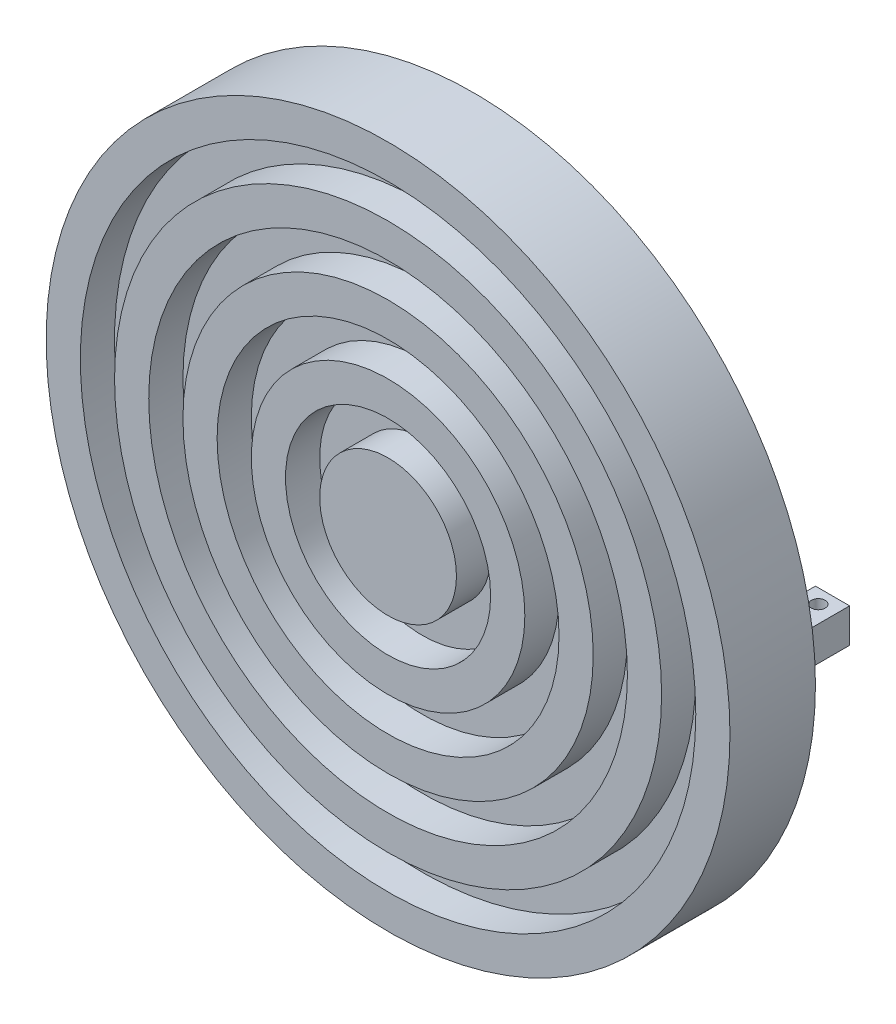
ISO-10303-21;
HEADER;
FILE_DESCRIPTION(('STEP AP214'),'2;1');
FILE_NAME('part.step','',(''),(''),'','','');
FILE_SCHEMA(('AUTOMOTIVE_DESIGN { 1 0 10303 214 1 1 1 1 }'));
ENDSEC;
DATA;
#1=APPLICATION_CONTEXT('core data for automotive mechanical design processes');
#2=APPLICATION_PROTOCOL_DEFINITION('international standard','automotive_design',2000,#1);
#3=PRODUCT_CONTEXT('',#1,'mechanical');
#4=PRODUCT('Part','Part','',(#3));
#5=PRODUCT_RELATED_PRODUCT_CATEGORY('part','',(#4));
#6=PRODUCT_DEFINITION_FORMATION('','',#4);
#7=PRODUCT_DEFINITION_CONTEXT('part definition',#1,'design');
#8=PRODUCT_DEFINITION('design','',#6,#7);
#9=PRODUCT_DEFINITION_SHAPE('','',#8);
#10=(LENGTH_UNIT() NAMED_UNIT(*) SI_UNIT(.MILLI.,.METRE.));
#11=(NAMED_UNIT(*) PLANE_ANGLE_UNIT() SI_UNIT($,.RADIAN.));
#12=(NAMED_UNIT(*) SI_UNIT($,.STERADIAN.) SOLID_ANGLE_UNIT());
#13=UNCERTAINTY_MEASURE_WITH_UNIT(LENGTH_MEASURE(1.E-05),#10,'distance_accuracy_value','');
#14=(GEOMETRIC_REPRESENTATION_CONTEXT(3) GLOBAL_UNCERTAINTY_ASSIGNED_CONTEXT((#13)) GLOBAL_UNIT_ASSIGNED_CONTEXT((#10,
#11,#12)) REPRESENTATION_CONTEXT('',''));
#15=CARTESIAN_POINT('',(0.,0.,0.));
#16=DIRECTION('',(0.,0.,1.));
#17=DIRECTION('',(1.,0.,0.));
#18=AXIS2_PLACEMENT_3D('',#15,#16,#17);
#19=CARTESIAN_POINT('',(0.,0.,0.));
#20=DIRECTION('',(0.,0.,1.));
#21=DIRECTION('',(1.,0.,0.));
#22=AXIS2_PLACEMENT_3D('',#19,#20,#21);
#23=PLANE('',#22);
#24=CARTESIAN_POINT('',(0.,0.,0.));
#25=DIRECTION('',(0.,0.,1.));
#26=DIRECTION('',(1.,0.,0.));
#27=AXIS2_PLACEMENT_3D('',#24,#25,#26);
#28=CIRCLE('',#27,10.);
#29=CARTESIAN_POINT('',(10.,0.,0.));
#30=VERTEX_POINT('',#29);
#31=EDGE_CURVE('E48',#30,#30,#28,.T.);
#32=ORIENTED_EDGE('',*,*,#31,.F.);
#33=EDGE_LOOP('',(#32));
#34=FACE_BOUND('',#33,.T.);
#35=DIRECTION('',(0.,-1.,0.));
#36=VECTOR('',#35,1.);
#37=CARTESIAN_POINT('',(9.,0.5,0.));
#38=LINE('',#37,#36);
#39=CARTESIAN_POINT('',(9.,0.5,0.));
#40=VERTEX_POINT('',#39);
#41=CARTESIAN_POINT('',(9.,-0.5,0.));
#42=VERTEX_POINT('',#41);
#43=EDGE_CURVE('E254',#40,#42,#38,.T.);
#44=ORIENTED_EDGE('',*,*,#43,.F.);
#45=DIRECTION('',(1.,0.,0.));
#46=VECTOR('',#45,1.);
#47=CARTESIAN_POINT('',(8.,0.5,0.));
#48=LINE('',#47,#46);
#49=CARTESIAN_POINT('',(8.,0.5,0.));
#50=VERTEX_POINT('',#49);
#51=EDGE_CURVE('E271',#50,#40,#48,.T.);
#52=ORIENTED_EDGE('',*,*,#51,.F.);
#53=DIRECTION('',(0.,-1.,0.));
#54=VECTOR('',#53,1.);
#55=CARTESIAN_POINT('',(8.,0.5,0.));
#56=LINE('',#55,#54);
#57=CARTESIAN_POINT('',(8.,-0.5,0.));
#58=VERTEX_POINT('',#57);
#59=EDGE_CURVE('E264',#50,#58,#56,.T.);
#60=ORIENTED_EDGE('',*,*,#59,.T.);
#61=DIRECTION('',(1.,0.,0.));
#62=VECTOR('',#61,1.);
#63=CARTESIAN_POINT('',(8.,-0.5,0.));
#64=LINE('',#63,#62);
#65=EDGE_CURVE('E228',#58,#42,#64,.T.);
#66=ORIENTED_EDGE('',*,*,#65,.T.);
#67=EDGE_LOOP('',(#44,#52,#60,#66));
#68=FACE_BOUND('',#67,.T.);
#69=DIRECTION('',(0.,-1.,0.));
#70=VECTOR('',#69,1.);
#71=CARTESIAN_POINT('',(7.,0.5,0.));
#72=LINE('',#71,#70);
#73=CARTESIAN_POINT('',(7.,0.5,0.));
#74=VERTEX_POINT('',#73);
#75=CARTESIAN_POINT('',(7.,-0.5,0.));
#76=VERTEX_POINT('',#75);
#77=EDGE_CURVE('E224',#74,#76,#72,.T.);
#78=ORIENTED_EDGE('',*,*,#77,.F.);
#79=DIRECTION('',(1.,0.,0.));
#80=VECTOR('',#79,1.);
#81=CARTESIAN_POINT('',(6.,0.5,0.));
#82=LINE('',#81,#80);
#83=CARTESIAN_POINT('',(6.,0.5,0.));
#84=VERTEX_POINT('',#83);
#85=EDGE_CURVE('E241',#84,#74,#82,.T.);
#86=ORIENTED_EDGE('',*,*,#85,.F.);
#87=DIRECTION('',(0.,-1.,0.));
#88=VECTOR('',#87,1.);
#89=CARTESIAN_POINT('',(6.,0.5,0.));
#90=LINE('',#89,#88);
#91=CARTESIAN_POINT('',(6.,-0.5,0.));
#92=VERTEX_POINT('',#91);
#93=EDGE_CURVE('E234',#84,#92,#90,.T.);
#94=ORIENTED_EDGE('',*,*,#93,.T.);
#95=DIRECTION('',(1.,0.,0.));
#96=VECTOR('',#95,1.);
#97=CARTESIAN_POINT('',(6.,-0.5,0.));
#98=LINE('',#97,#96);
#99=EDGE_CURVE('E198',#92,#76,#98,.T.);
#100=ORIENTED_EDGE('',*,*,#99,.T.);
#101=EDGE_LOOP('',(#78,#86,#94,#100));
#102=FACE_BOUND('',#101,.T.);
#103=DIRECTION('',(0.,-1.,0.));
#104=VECTOR('',#103,1.);
#105=CARTESIAN_POINT('',(5.,0.5,0.));
#106=LINE('',#105,#104);
#107=CARTESIAN_POINT('',(5.,0.5,0.));
#108=VERTEX_POINT('',#107);
#109=CARTESIAN_POINT('',(5.,-0.5,0.));
#110=VERTEX_POINT('',#109);
#111=EDGE_CURVE('E64',#108,#110,#106,.T.);
#112=ORIENTED_EDGE('',*,*,#111,.F.);
#113=DIRECTION('',(1.,0.,0.));
#114=VECTOR('',#113,1.);
#115=CARTESIAN_POINT('',(4.,0.5,0.));
#116=LINE('',#115,#114);
#117=CARTESIAN_POINT('',(4.,0.5,0.));
#118=VERTEX_POINT('',#117);
#119=EDGE_CURVE('E211',#118,#108,#116,.T.);
#120=ORIENTED_EDGE('',*,*,#119,.F.);
#121=DIRECTION('',(0.,-1.,0.));
#122=VECTOR('',#121,1.);
#123=CARTESIAN_POINT('',(4.,0.5,0.));
#124=LINE('',#123,#122);
#125=CARTESIAN_POINT('',(4.,-0.5,0.));
#126=VERTEX_POINT('',#125);
#127=EDGE_CURVE('E204',#118,#126,#124,.T.);
#128=ORIENTED_EDGE('',*,*,#127,.T.);
#129=DIRECTION('',(1.,0.,0.));
#130=VECTOR('',#129,1.);
#131=CARTESIAN_POINT('',(4.,-0.5,0.));
#132=LINE('',#131,#130);
#133=EDGE_CURVE('E187',#126,#110,#132,.T.);
#134=ORIENTED_EDGE('',*,*,#133,.T.);
#135=EDGE_LOOP('',(#112,#120,#128,#134));
#136=FACE_BOUND('',#135,.T.);
#137=DIRECTION('',(1.,0.,0.));
#138=VECTOR('',#137,1.);
#139=CARTESIAN_POINT('',(2.,0.5,0.));
#140=LINE('',#139,#138);
#141=CARTESIAN_POINT('',(2.,0.5,0.));
#142=VERTEX_POINT('',#141);
#143=CARTESIAN_POINT('',(3.,0.5,0.));
#144=VERTEX_POINT('',#143);
#145=EDGE_CURVE('E157',#142,#144,#140,.T.);
#146=ORIENTED_EDGE('',*,*,#145,.F.);
#147=DIRECTION('',(0.,-1.,0.));
#148=VECTOR('',#147,1.);
#149=CARTESIAN_POINT('',(2.,0.5,0.));
#150=LINE('',#149,#148);
#151=CARTESIAN_POINT('',(2.,-0.5,0.));
#152=VERTEX_POINT('',#151);
#153=EDGE_CURVE('E168',#142,#152,#150,.T.);
#154=ORIENTED_EDGE('',*,*,#153,.T.);
#155=DIRECTION('',(1.,0.,0.));
#156=VECTOR('',#155,1.);
#157=CARTESIAN_POINT('',(2.,-0.5,0.));
#158=LINE('',#157,#156);
#159=CARTESIAN_POINT('',(3.,-0.5,0.));
#160=VERTEX_POINT('',#159);
#161=EDGE_CURVE('E186',#152,#160,#158,.T.);
#162=ORIENTED_EDGE('',*,*,#161,.T.);
#163=DIRECTION('',(0.,-1.,0.));
#164=VECTOR('',#163,1.);
#165=CARTESIAN_POINT('',(3.,0.5,0.));
#166=LINE('',#165,#164);
#167=EDGE_CURVE('E175',#144,#160,#166,.T.);
#168=ORIENTED_EDGE('',*,*,#167,.F.);
#169=EDGE_LOOP('',(#146,#154,#162,#168));
#170=FACE_BOUND('',#169,.T.);
#171=ADVANCED_FACE('F39',(#34,#68,#102,#136,#170),#23,.F.);
#172=CARTESIAN_POINT('',(0.,0.,2.5));
#173=DIRECTION('',(0.,0.,1.));
#174=DIRECTION('',(1.,0.,0.));
#175=AXIS2_PLACEMENT_3D('',#172,#173,#174);
#176=PLANE('',#175);
#177=CARTESIAN_POINT('',(0.,0.,2.49999999999996));
#178=DIRECTION('',(0.,0.,1.));
#179=DIRECTION('',(1.,0.,0.));
#180=AXIS2_PLACEMENT_3D('',#177,#178,#179);
#181=CIRCLE('',#180,9.);
#182=CARTESIAN_POINT('',(9.,0.,2.49999999999996));
#183=VERTEX_POINT('',#182);
#184=EDGE_CURVE('E292',#183,#183,#181,.T.);
#185=ORIENTED_EDGE('',*,*,#184,.F.);
#186=EDGE_LOOP('',(#185));
#187=FACE_BOUND('',#186,.T.);
#188=CARTESIAN_POINT('',(0.,0.,2.5));
#189=DIRECTION('',(0.,0.,1.));
#190=DIRECTION('',(1.,0.,0.));
#191=AXIS2_PLACEMENT_3D('',#188,#189,#190);
#192=CIRCLE('',#191,10.);
#193=CARTESIAN_POINT('',(10.,0.,2.5));
#194=VERTEX_POINT('',#193);
#195=EDGE_CURVE('E11',#194,#194,#192,.T.);
#196=ORIENTED_EDGE('',*,*,#195,.T.);
#197=EDGE_LOOP('',(#196));
#198=FACE_BOUND('',#197,.T.);
#199=ADVANCED_FACE('F372',(#187,#198),#176,.T.);
#200=CARTESIAN_POINT('',(0.,0.,2.5));
#201=DIRECTION('',(0.,0.,-1.));
#202=DIRECTION('',(-1.,0.,0.));
#203=AXIS2_PLACEMENT_3D('',#200,#201,#202);
#204=CYLINDRICAL_SURFACE('',#203,10.);
#205=ORIENTED_EDGE('',*,*,#195,.F.);
#206=EDGE_LOOP('',(#205));
#207=FACE_BOUND('',#206,.T.);
#208=ORIENTED_EDGE('',*,*,#31,.T.);
#209=EDGE_LOOP('',(#208));
#210=FACE_BOUND('',#209,.T.);
#211=ADVANCED_FACE('F41',(#207,#210),#204,.T.);
#212=CARTESIAN_POINT('',(0.,0.,2.5));
#213=DIRECTION('',(0.,0.,1.));
#214=DIRECTION('',(1.,0.,0.));
#215=AXIS2_PLACEMENT_3D('',#212,#213,#214);
#216=CYLINDRICAL_SURFACE('',#215,9.);
#217=CARTESIAN_POINT('',(0.,0.,1.49999999999996));
#218=DIRECTION('',(0.,0.,1.));
#219=DIRECTION('',(1.,0.,0.));
#220=AXIS2_PLACEMENT_3D('',#217,#218,#219);
#221=CIRCLE('',#220,9.);
#222=CARTESIAN_POINT('',(9.,0.,1.49999999999996));
#223=VERTEX_POINT('',#222);
#224=EDGE_CURVE('E289',#223,#223,#221,.T.);
#225=ORIENTED_EDGE('',*,*,#224,.F.);
#226=EDGE_LOOP('',(#225));
#227=FACE_BOUND('',#226,.T.);
#228=ORIENTED_EDGE('',*,*,#184,.T.);
#229=EDGE_LOOP('',(#228));
#230=FACE_BOUND('',#229,.T.);
#231=ADVANCED_FACE('F426',(#227,#230),#216,.F.);
#232=CARTESIAN_POINT('',(8.,0.,1.49999999999996));
#233=DIRECTION('',(0.,0.,-1.));
#234=DIRECTION('',(-1.,0.,0.));
#235=AXIS2_PLACEMENT_3D('',#232,#233,#234);
#236=PLANE('',#235);
#237=CARTESIAN_POINT('',(0.,0.,1.49999999999996));
#238=DIRECTION('',(0.,0.,1.));
#239=DIRECTION('',(1.,0.,0.));
#240=AXIS2_PLACEMENT_3D('',#237,#238,#239);
#241=CIRCLE('',#240,8.);
#242=CARTESIAN_POINT('',(8.,0.,1.49999999999996));
#243=VERTEX_POINT('',#242);
#244=EDGE_CURVE('E286',#243,#243,#241,.T.);
#245=ORIENTED_EDGE('',*,*,#244,.F.);
#246=EDGE_LOOP('',(#245));
#247=FACE_BOUND('',#246,.T.);
#248=ORIENTED_EDGE('',*,*,#224,.T.);
#249=EDGE_LOOP('',(#248));
#250=FACE_BOUND('',#249,.T.);
#251=ADVANCED_FACE('F429',(#247,#250),#236,.F.);
#252=CARTESIAN_POINT('',(0.,0.,2.5));
#253=DIRECTION('',(0.,0.,1.));
#254=DIRECTION('',(1.,0.,0.));
#255=AXIS2_PLACEMENT_3D('',#252,#253,#254);
#256=CYLINDRICAL_SURFACE('',#255,8.);
#257=CARTESIAN_POINT('',(0.,0.,2.49999999999996));
#258=DIRECTION('',(0.,0.,1.));
#259=DIRECTION('',(1.,0.,0.));
#260=AXIS2_PLACEMENT_3D('',#257,#258,#259);
#261=CIRCLE('',#260,8.);
#262=CARTESIAN_POINT('',(8.,0.,2.49999999999996));
#263=VERTEX_POINT('',#262);
#264=EDGE_CURVE('E174',#263,#263,#261,.T.);
#265=ORIENTED_EDGE('',*,*,#264,.F.);
#266=EDGE_LOOP('',(#265));
#267=FACE_BOUND('',#266,.T.);
#268=ORIENTED_EDGE('',*,*,#244,.T.);
#269=EDGE_LOOP('',(#268));
#270=FACE_BOUND('',#269,.T.);
#271=ADVANCED_FACE('F433',(#267,#270),#256,.T.);
#272=CARTESIAN_POINT('',(0.,0.,2.49999999999997));
#273=DIRECTION('',(0.,0.,1.));
#274=DIRECTION('',(1.,0.,0.));
#275=AXIS2_PLACEMENT_3D('',#272,#273,#274);
#276=CIRCLE('',#275,7.);
#277=CARTESIAN_POINT('',(7.,0.,2.49999999999997));
#278=VERTEX_POINT('',#277);
#279=EDGE_CURVE('E304',#278,#278,#276,.T.);
#280=ORIENTED_EDGE('',*,*,#279,.F.);
#281=EDGE_LOOP('',(#280));
#282=FACE_BOUND('',#281,.T.);
#283=ORIENTED_EDGE('',*,*,#264,.T.);
#284=EDGE_LOOP('',(#283));
#285=FACE_BOUND('',#284,.T.);
#286=ADVANCED_FACE('F391',(#282,#285),#176,.T.);
#287=CARTESIAN_POINT('',(0.,0.,2.5));
#288=DIRECTION('',(0.,0.,1.));
#289=DIRECTION('',(1.,0.,0.));
#290=AXIS2_PLACEMENT_3D('',#287,#288,#289);
#291=CYLINDRICAL_SURFACE('',#290,7.);
#292=CARTESIAN_POINT('',(0.,0.,1.49999999999997));
#293=DIRECTION('',(0.,0.,1.));
#294=DIRECTION('',(1.,0.,0.));
#295=AXIS2_PLACEMENT_3D('',#292,#293,#294);
#296=CIRCLE('',#295,7.);
#297=CARTESIAN_POINT('',(7.,0.,1.49999999999997));
#298=VERTEX_POINT('',#297);
#299=EDGE_CURVE('E301',#298,#298,#296,.T.);
#300=ORIENTED_EDGE('',*,*,#299,.F.);
#301=EDGE_LOOP('',(#300));
#302=FACE_BOUND('',#301,.T.);
#303=ORIENTED_EDGE('',*,*,#279,.T.);
#304=EDGE_LOOP('',(#303));
#305=FACE_BOUND('',#304,.T.);
#306=ADVANCED_FACE('F414',(#302,#305),#291,.F.);
#307=CARTESIAN_POINT('',(6.,0.,1.49999999999997));
#308=DIRECTION('',(0.,0.,-1.));
#309=DIRECTION('',(-1.,0.,0.));
#310=AXIS2_PLACEMENT_3D('',#307,#308,#309);
#311=PLANE('',#310);
#312=CARTESIAN_POINT('',(0.,0.,1.49999999999997));
#313=DIRECTION('',(0.,0.,1.));
#314=DIRECTION('',(1.,0.,0.));
#315=AXIS2_PLACEMENT_3D('',#312,#313,#314);
#316=CIRCLE('',#315,6.);
#317=CARTESIAN_POINT('',(6.,0.,1.49999999999997));
#318=VERTEX_POINT('',#317);
#319=EDGE_CURVE('E298',#318,#318,#316,.T.);
#320=ORIENTED_EDGE('',*,*,#319,.F.);
#321=EDGE_LOOP('',(#320));
#322=FACE_BOUND('',#321,.T.);
#323=ORIENTED_EDGE('',*,*,#299,.T.);
#324=EDGE_LOOP('',(#323));
#325=FACE_BOUND('',#324,.T.);
#326=ADVANCED_FACE('F417',(#322,#325),#311,.F.);
#327=CARTESIAN_POINT('',(0.,0.,2.5));
#328=DIRECTION('',(0.,0.,1.));
#329=DIRECTION('',(1.,0.,0.));
#330=AXIS2_PLACEMENT_3D('',#327,#328,#329);
#331=CYLINDRICAL_SURFACE('',#330,6.);
#332=CARTESIAN_POINT('',(0.,0.,2.49999999999997));
#333=DIRECTION('',(0.,0.,1.));
#334=DIRECTION('',(1.,0.,0.));
#335=AXIS2_PLACEMENT_3D('',#332,#333,#334);
#336=CIRCLE('',#335,6.);
#337=CARTESIAN_POINT('',(6.,0.,2.49999999999997));
#338=VERTEX_POINT('',#337);
#339=EDGE_CURVE('E295',#338,#338,#336,.T.);
#340=ORIENTED_EDGE('',*,*,#339,.F.);
#341=EDGE_LOOP('',(#340));
#342=FACE_BOUND('',#341,.T.);
#343=ORIENTED_EDGE('',*,*,#319,.T.);
#344=EDGE_LOOP('',(#343));
#345=FACE_BOUND('',#344,.T.);
#346=ADVANCED_FACE('F421',(#342,#345),#331,.T.);
#347=ORIENTED_EDGE('',*,*,#339,.T.);
#348=EDGE_LOOP('',(#347));
#349=FACE_BOUND('',#348,.T.);
#350=CARTESIAN_POINT('',(0.,0.,2.49999999999999));
#351=DIRECTION('',(0.,0.,1.));
#352=DIRECTION('',(1.,0.,0.));
#353=AXIS2_PLACEMENT_3D('',#350,#351,#352);
#354=CIRCLE('',#353,5.);
#355=CARTESIAN_POINT('',(5.,0.,2.49999999999999));
#356=VERTEX_POINT('',#355);
#357=EDGE_CURVE('E316',#356,#356,#354,.T.);
#358=ORIENTED_EDGE('',*,*,#357,.F.);
#359=EDGE_LOOP('',(#358));
#360=FACE_BOUND('',#359,.T.);
#361=ADVANCED_FACE('F382',(#349,#360),#176,.T.);
#362=CARTESIAN_POINT('',(0.,0.,2.5));
#363=DIRECTION('',(0.,0.,1.));
#364=DIRECTION('',(1.,0.,0.));
#365=AXIS2_PLACEMENT_3D('',#362,#363,#364);
#366=CYLINDRICAL_SURFACE('',#365,5.);
#367=CARTESIAN_POINT('',(0.,0.,1.49999999999999));
#368=DIRECTION('',(0.,0.,1.));
#369=DIRECTION('',(1.,0.,0.));
#370=AXIS2_PLACEMENT_3D('',#367,#368,#369);
#371=CIRCLE('',#370,5.);
#372=CARTESIAN_POINT('',(5.,0.,1.49999999999999));
#373=VERTEX_POINT('',#372);
#374=EDGE_CURVE('E313',#373,#373,#371,.T.);
#375=ORIENTED_EDGE('',*,*,#374,.F.);
#376=EDGE_LOOP('',(#375));
#377=FACE_BOUND('',#376,.T.);
#378=ORIENTED_EDGE('',*,*,#357,.T.);
#379=EDGE_LOOP('',(#378));
#380=FACE_BOUND('',#379,.T.);
#381=ADVANCED_FACE('F403',(#377,#380),#366,.F.);
#382=CARTESIAN_POINT('',(4.,0.,1.49999999999999));
#383=DIRECTION('',(0.,0.,-1.));
#384=DIRECTION('',(-1.,0.,0.));
#385=AXIS2_PLACEMENT_3D('',#382,#383,#384);
#386=PLANE('',#385);
#387=CARTESIAN_POINT('',(0.,0.,1.49999999999999));
#388=DIRECTION('',(0.,0.,1.));
#389=DIRECTION('',(1.,0.,0.));
#390=AXIS2_PLACEMENT_3D('',#387,#388,#389);
#391=CIRCLE('',#390,4.);
#392=CARTESIAN_POINT('',(4.,0.,1.49999999999999));
#393=VERTEX_POINT('',#392);
#394=EDGE_CURVE('E310',#393,#393,#391,.T.);
#395=ORIENTED_EDGE('',*,*,#394,.F.);
#396=EDGE_LOOP('',(#395));
#397=FACE_BOUND('',#396,.T.);
#398=ORIENTED_EDGE('',*,*,#374,.T.);
#399=EDGE_LOOP('',(#398));
#400=FACE_BOUND('',#399,.T.);
#401=ADVANCED_FACE('F406',(#397,#400),#386,.F.);
#402=CARTESIAN_POINT('',(0.,0.,2.5));
#403=DIRECTION('',(0.,0.,1.));
#404=DIRECTION('',(1.,0.,0.));
#405=AXIS2_PLACEMENT_3D('',#402,#403,#404);
#406=CYLINDRICAL_SURFACE('',#405,4.);
#407=CARTESIAN_POINT('',(0.,0.,2.49999999999999));
#408=DIRECTION('',(0.,0.,1.));
#409=DIRECTION('',(1.,0.,0.));
#410=AXIS2_PLACEMENT_3D('',#407,#408,#409);
#411=CIRCLE('',#410,4.);
#412=CARTESIAN_POINT('',(4.,0.,2.49999999999999));
#413=VERTEX_POINT('',#412);
#414=EDGE_CURVE('E307',#413,#413,#411,.T.);
#415=ORIENTED_EDGE('',*,*,#414,.F.);
#416=EDGE_LOOP('',(#415));
#417=FACE_BOUND('',#416,.T.);
#418=ORIENTED_EDGE('',*,*,#394,.T.);
#419=EDGE_LOOP('',(#418));
#420=FACE_BOUND('',#419,.T.);
#421=ADVANCED_FACE('F389',(#417,#420),#406,.T.);
#422=ORIENTED_EDGE('',*,*,#414,.T.);
#423=EDGE_LOOP('',(#422));
#424=FACE_BOUND('',#423,.T.);
#425=CARTESIAN_POINT('',(0.,0.,2.5));
#426=DIRECTION('',(0.,0.,1.));
#427=DIRECTION('',(1.,0.,0.));
#428=AXIS2_PLACEMENT_3D('',#425,#426,#427);
#429=CIRCLE('',#428,3.);
#430=CARTESIAN_POINT('',(3.,0.,2.5));
#431=VERTEX_POINT('',#430);
#432=EDGE_CURVE('E322',#431,#431,#429,.T.);
#433=ORIENTED_EDGE('',*,*,#432,.F.);
#434=EDGE_LOOP('',(#433));
#435=FACE_BOUND('',#434,.T.);
#436=ADVANCED_FACE('F385',(#424,#435),#176,.T.);
#437=CARTESIAN_POINT('',(0.,0.,2.5));
#438=DIRECTION('',(0.,0.,1.));
#439=DIRECTION('',(1.,0.,0.));
#440=AXIS2_PLACEMENT_3D('',#437,#438,#439);
#441=CYLINDRICAL_SURFACE('',#440,2.);
#442=CARTESIAN_POINT('',(0.,0.,2.5));
#443=DIRECTION('',(0.,0.,1.));
#444=DIRECTION('',(1.,0.,0.));
#445=AXIS2_PLACEMENT_3D('',#442,#443,#444);
#446=CIRCLE('',#445,2.);
#447=CARTESIAN_POINT('',(2.,0.,2.5));
#448=VERTEX_POINT('',#447);
#449=EDGE_CURVE('E319',#448,#448,#446,.T.);
#450=ORIENTED_EDGE('',*,*,#449,.F.);
#451=EDGE_LOOP('',(#450));
#452=FACE_BOUND('',#451,.T.);
#453=CARTESIAN_POINT('',(0.,0.,1.5));
#454=DIRECTION('',(0.,0.,1.));
#455=DIRECTION('',(1.,0.,0.));
#456=AXIS2_PLACEMENT_3D('',#453,#454,#455);
#457=CIRCLE('',#456,2.);
#458=CARTESIAN_POINT('',(2.,0.,1.5));
#459=VERTEX_POINT('',#458);
#460=EDGE_CURVE('E328',#459,#459,#457,.T.);
#461=ORIENTED_EDGE('',*,*,#460,.T.);
#462=EDGE_LOOP('',(#461));
#463=FACE_BOUND('',#462,.T.);
#464=ADVANCED_FACE('F388',(#452,#463),#441,.T.);
#465=CARTESIAN_POINT('',(2.,0.,1.5));
#466=DIRECTION('',(0.,0.,-1.));
#467=DIRECTION('',(-1.,0.,0.));
#468=AXIS2_PLACEMENT_3D('',#465,#466,#467);
#469=PLANE('',#468);
#470=ORIENTED_EDGE('',*,*,#460,.F.);
#471=EDGE_LOOP('',(#470));
#472=FACE_BOUND('',#471,.T.);
#473=CARTESIAN_POINT('',(0.,0.,1.5));
#474=DIRECTION('',(0.,0.,1.));
#475=DIRECTION('',(1.,0.,0.));
#476=AXIS2_PLACEMENT_3D('',#473,#474,#475);
#477=CIRCLE('',#476,3.);
#478=CARTESIAN_POINT('',(3.,0.,1.5));
#479=VERTEX_POINT('',#478);
#480=EDGE_CURVE('E325',#479,#479,#477,.T.);
#481=ORIENTED_EDGE('',*,*,#480,.T.);
#482=EDGE_LOOP('',(#481));
#483=FACE_BOUND('',#482,.T.);
#484=ADVANCED_FACE('F394',(#472,#483),#469,.F.);
#485=CARTESIAN_POINT('',(0.,0.,2.5));
#486=DIRECTION('',(0.,0.,1.));
#487=DIRECTION('',(1.,0.,0.));
#488=AXIS2_PLACEMENT_3D('',#485,#486,#487);
#489=CYLINDRICAL_SURFACE('',#488,3.);
#490=ORIENTED_EDGE('',*,*,#480,.F.);
#491=EDGE_LOOP('',(#490));
#492=FACE_BOUND('',#491,.T.);
#493=ORIENTED_EDGE('',*,*,#432,.T.);
#494=EDGE_LOOP('',(#493));
#495=FACE_BOUND('',#494,.T.);
#496=ADVANCED_FACE('F398',(#492,#495),#489,.F.);
#497=ORIENTED_EDGE('',*,*,#449,.T.);
#498=EDGE_LOOP('',(#497));
#499=FACE_BOUND('',#498,.T.);
#500=ADVANCED_FACE('F381',(#499),#176,.T.);
#501=CARTESIAN_POINT('',(9.,0.5,0.));
#502=DIRECTION('',(-1.,0.,0.));
#503=DIRECTION('',(0.,0.,1.));
#504=AXIS2_PLACEMENT_3D('',#501,#502,#503);
#505=PLANE('',#504);
#506=DIRECTION('',(0.,0.,-1.));
#507=VECTOR('',#506,1.);
#508=CARTESIAN_POINT('',(9.,-0.5,0.));
#509=LINE('',#508,#507);
#510=CARTESIAN_POINT('',(9.,-0.5,-2.00000000000004));
#511=VERTEX_POINT('',#510);
#512=EDGE_CURVE('E273',#42,#511,#509,.T.);
#513=ORIENTED_EDGE('',*,*,#512,.T.);
#514=DIRECTION('',(0.,-1.,0.));
#515=VECTOR('',#514,1.);
#516=CARTESIAN_POINT('',(9.,0.5,-2.00000000000004));
#517=LINE('',#516,#515);
#518=CARTESIAN_POINT('',(9.,0.5,-2.00000000000004));
#519=VERTEX_POINT('',#518);
#520=EDGE_CURVE('E257',#519,#511,#517,.T.);
#521=ORIENTED_EDGE('',*,*,#520,.F.);
#522=DIRECTION('',(0.,0.,-1.));
#523=VECTOR('',#522,1.);
#524=CARTESIAN_POINT('',(9.,0.5,0.));
#525=LINE('',#524,#523);
#526=EDGE_CURVE('E280',#40,#519,#525,.T.);
#527=ORIENTED_EDGE('',*,*,#526,.F.);
#528=ORIENTED_EDGE('',*,*,#43,.T.);
#529=EDGE_LOOP('',(#513,#521,#527,#528));
#530=FACE_BOUND('',#529,.T.);
#531=ADVANCED_FACE('F452',(#530),#505,.F.);
#532=CARTESIAN_POINT('',(8.,0.5,-2.00000000000004));
#533=DIRECTION('',(0.,0.,1.));
#534=DIRECTION('',(1.,0.,0.));
#535=AXIS2_PLACEMENT_3D('',#532,#533,#534);
#536=PLANE('',#535);
#537=DIRECTION('',(-1.,0.,0.));
#538=VECTOR('',#537,1.);
#539=CARTESIAN_POINT('',(8.,-0.5,-2.00000000000004));
#540=LINE('',#539,#538);
#541=CARTESIAN_POINT('',(8.,-0.5,-2.00000000000004));
#542=VERTEX_POINT('',#541);
#543=EDGE_CURVE('E270',#511,#542,#540,.T.);
#544=ORIENTED_EDGE('',*,*,#543,.T.);
#545=DIRECTION('',(0.,-1.,0.));
#546=VECTOR('',#545,1.);
#547=CARTESIAN_POINT('',(8.,0.5,-2.00000000000004));
#548=LINE('',#547,#546);
#549=CARTESIAN_POINT('',(8.,0.5,-2.00000000000004));
#550=VERTEX_POINT('',#549);
#551=EDGE_CURVE('E261',#550,#542,#548,.T.);
#552=ORIENTED_EDGE('',*,*,#551,.F.);
#553=DIRECTION('',(-1.,0.,0.));
#554=VECTOR('',#553,1.);
#555=CARTESIAN_POINT('',(8.,0.5,-2.00000000000004));
#556=LINE('',#555,#554);
#557=EDGE_CURVE('E278',#519,#550,#556,.T.);
#558=ORIENTED_EDGE('',*,*,#557,.F.);
#559=ORIENTED_EDGE('',*,*,#520,.T.);
#560=EDGE_LOOP('',(#544,#552,#558,#559));
#561=FACE_BOUND('',#560,.T.);
#562=ADVANCED_FACE('F448',(#561),#536,.F.);
#563=CARTESIAN_POINT('',(8.,0.5,0.));
#564=DIRECTION('',(1.,0.,0.));
#565=DIRECTION('',(0.,0.,-1.));
#566=AXIS2_PLACEMENT_3D('',#563,#564,#565);
#567=PLANE('',#566);
#568=DIRECTION('',(0.,0.,1.));
#569=VECTOR('',#568,1.);
#570=CARTESIAN_POINT('',(8.,-0.5,0.));
#571=LINE('',#570,#569);
#572=EDGE_CURVE('E267',#542,#58,#571,.T.);
#573=ORIENTED_EDGE('',*,*,#572,.T.);
#574=ORIENTED_EDGE('',*,*,#59,.F.);
#575=DIRECTION('',(0.,0.,1.));
#576=VECTOR('',#575,1.);
#577=CARTESIAN_POINT('',(8.,0.5,0.));
#578=LINE('',#577,#576);
#579=EDGE_CURVE('E266',#550,#50,#578,.T.);
#580=ORIENTED_EDGE('',*,*,#579,.F.);
#581=ORIENTED_EDGE('',*,*,#551,.T.);
#582=EDGE_LOOP('',(#573,#574,#580,#581));
#583=FACE_BOUND('',#582,.T.);
#584=ADVANCED_FACE('F441',(#583),#567,.F.);
#585=CARTESIAN_POINT('',(0.,0.5,0.));
#586=DIRECTION('',(0.,1.,0.));
#587=DIRECTION('',(0.,0.,1.));
#588=AXIS2_PLACEMENT_3D('',#585,#586,#587);
#589=PLANE('',#588);
#590=CARTESIAN_POINT('',(8.5,0.5,-1.58337324574327));
#591=DIRECTION('',(0.,1.,0.));
#592=DIRECTION('',(0.,0.,1.));
#593=AXIS2_PLACEMENT_3D('',#590,#591,#592);
#594=CIRCLE('',#593,0.200000000000001);
#595=CARTESIAN_POINT('',(8.5,0.5,-1.38337324574327));
#596=VERTEX_POINT('',#595);
#597=EDGE_CURVE('E258',#596,#596,#594,.T.);
#598=ORIENTED_EDGE('',*,*,#597,.F.);
#599=EDGE_LOOP('',(#598));
#600=FACE_BOUND('',#599,.T.);
#601=ORIENTED_EDGE('',*,*,#51,.T.);
#602=ORIENTED_EDGE('',*,*,#526,.T.);
#603=ORIENTED_EDGE('',*,*,#557,.T.);
#604=ORIENTED_EDGE('',*,*,#579,.T.);
#605=EDGE_LOOP('',(#601,#602,#603,#604));
#606=FACE_BOUND('',#605,.T.);
#607=ADVANCED_FACE('F438',(#600,#606),#589,.T.);
#608=CARTESIAN_POINT('',(0.,-0.5,0.));
#609=DIRECTION('',(0.,1.,0.));
#610=DIRECTION('',(0.,0.,1.));
#611=AXIS2_PLACEMENT_3D('',#608,#609,#610);
#612=PLANE('',#611);
#613=CARTESIAN_POINT('',(8.5,-0.5,-1.58337324574327));
#614=DIRECTION('',(0.,1.,0.));
#615=DIRECTION('',(0.,0.,1.));
#616=AXIS2_PLACEMENT_3D('',#613,#614,#615);
#617=CIRCLE('',#616,0.200000000000001);
#618=CARTESIAN_POINT('',(8.5,-0.5,-1.38337324574327));
#619=VERTEX_POINT('',#618);
#620=EDGE_CURVE('E43',#619,#619,#617,.T.);
#621=ORIENTED_EDGE('',*,*,#620,.T.);
#622=EDGE_LOOP('',(#621));
#623=FACE_BOUND('',#622,.T.);
#624=ORIENTED_EDGE('',*,*,#65,.F.);
#625=ORIENTED_EDGE('',*,*,#572,.F.);
#626=ORIENTED_EDGE('',*,*,#543,.F.);
#627=ORIENTED_EDGE('',*,*,#512,.F.);
#628=EDGE_LOOP('',(#624,#625,#626,#627));
#629=FACE_BOUND('',#628,.T.);
#630=ADVANCED_FACE('F358',(#623,#629),#612,.F.);
#631=CARTESIAN_POINT('',(7.,0.5,0.));
#632=DIRECTION('',(-1.,0.,0.));
#633=DIRECTION('',(0.,0.,1.));
#634=AXIS2_PLACEMENT_3D('',#631,#632,#633);
#635=PLANE('',#634);
#636=DIRECTION('',(0.,0.,-1.));
#637=VECTOR('',#636,1.);
#638=CARTESIAN_POINT('',(7.,-0.5,0.));
#639=LINE('',#638,#637);
#640=CARTESIAN_POINT('',(7.,-0.5,-2.00000000000003));
#641=VERTEX_POINT('',#640);
#642=EDGE_CURVE('E243',#76,#641,#639,.T.);
#643=ORIENTED_EDGE('',*,*,#642,.T.);
#644=DIRECTION('',(0.,-1.,0.));
#645=VECTOR('',#644,1.);
#646=CARTESIAN_POINT('',(7.,0.5,-2.00000000000003));
#647=LINE('',#646,#645);
#648=CARTESIAN_POINT('',(7.,0.5,-2.00000000000003));
#649=VERTEX_POINT('',#648);
#650=EDGE_CURVE('E227',#649,#641,#647,.T.);
#651=ORIENTED_EDGE('',*,*,#650,.F.);
#652=DIRECTION('',(0.,0.,-1.));
#653=VECTOR('',#652,1.);
#654=CARTESIAN_POINT('',(7.,0.5,0.));
#655=LINE('',#654,#653);
#656=EDGE_CURVE('E250',#74,#649,#655,.T.);
#657=ORIENTED_EDGE('',*,*,#656,.F.);
#658=ORIENTED_EDGE('',*,*,#77,.T.);
#659=EDGE_LOOP('',(#643,#651,#657,#658));
#660=FACE_BOUND('',#659,.T.);
#661=ADVANCED_FACE('F445',(#660),#635,.F.);
#662=CARTESIAN_POINT('',(6.,0.5,-2.00000000000003));
#663=DIRECTION('',(0.,0.,1.));
#664=DIRECTION('',(1.,0.,0.));
#665=AXIS2_PLACEMENT_3D('',#662,#663,#664);
#666=PLANE('',#665);
#667=DIRECTION('',(-1.,0.,0.));
#668=VECTOR('',#667,1.);
#669=CARTESIAN_POINT('',(6.,-0.5,-2.00000000000003));
#670=LINE('',#669,#668);
#671=CARTESIAN_POINT('',(6.,-0.5,-2.00000000000003));
#672=VERTEX_POINT('',#671);
#673=EDGE_CURVE('E240',#641,#672,#670,.T.);
#674=ORIENTED_EDGE('',*,*,#673,.T.);
#675=DIRECTION('',(0.,-1.,0.));
#676=VECTOR('',#675,1.);
#677=CARTESIAN_POINT('',(6.,0.5,-2.00000000000003));
#678=LINE('',#677,#676);
#679=CARTESIAN_POINT('',(6.,0.5,-2.00000000000003));
#680=VERTEX_POINT('',#679);
#681=EDGE_CURVE('E231',#680,#672,#678,.T.);
#682=ORIENTED_EDGE('',*,*,#681,.F.);
#683=DIRECTION('',(-1.,0.,0.));
#684=VECTOR('',#683,1.);
#685=CARTESIAN_POINT('',(6.,0.5,-2.00000000000003));
#686=LINE('',#685,#684);
#687=EDGE_CURVE('E248',#649,#680,#686,.T.);
#688=ORIENTED_EDGE('',*,*,#687,.F.);
#689=ORIENTED_EDGE('',*,*,#650,.T.);
#690=EDGE_LOOP('',(#674,#682,#688,#689));
#691=FACE_BOUND('',#690,.T.);
#692=ADVANCED_FACE('F467',(#691),#666,.F.);
#693=CARTESIAN_POINT('',(6.,0.5,0.));
#694=DIRECTION('',(1.,0.,0.));
#695=DIRECTION('',(0.,0.,-1.));
#696=AXIS2_PLACEMENT_3D('',#693,#694,#695);
#697=PLANE('',#696);
#698=DIRECTION('',(0.,0.,1.));
#699=VECTOR('',#698,1.);
#700=CARTESIAN_POINT('',(6.,-0.5,0.));
#701=LINE('',#700,#699);
#702=EDGE_CURVE('E237',#672,#92,#701,.T.);
#703=ORIENTED_EDGE('',*,*,#702,.T.);
#704=ORIENTED_EDGE('',*,*,#93,.F.);
#705=DIRECTION('',(0.,0.,1.));
#706=VECTOR('',#705,1.);
#707=CARTESIAN_POINT('',(6.,0.5,0.));
#708=LINE('',#707,#706);
#709=EDGE_CURVE('E236',#680,#84,#708,.T.);
#710=ORIENTED_EDGE('',*,*,#709,.F.);
#711=ORIENTED_EDGE('',*,*,#681,.T.);
#712=EDGE_LOOP('',(#703,#704,#710,#711));
#713=FACE_BOUND('',#712,.T.);
#714=ADVANCED_FACE('F460',(#713),#697,.F.);
#715=CARTESIAN_POINT('',(0.,0.5,0.));
#716=DIRECTION('',(0.,1.,0.));
#717=DIRECTION('',(0.,0.,1.));
#718=AXIS2_PLACEMENT_3D('',#715,#716,#717);
#719=PLANE('',#718);
#720=CARTESIAN_POINT('',(6.5,0.5,-1.58337324574327));
#721=DIRECTION('',(0.,1.,0.));
#722=DIRECTION('',(0.,0.,1.));
#723=AXIS2_PLACEMENT_3D('',#720,#721,#722);
#724=CIRCLE('',#723,0.200000000000001);
#725=CARTESIAN_POINT('',(6.5,0.5,-1.38337324574327));
#726=VERTEX_POINT('',#725);
#727=EDGE_CURVE('E342',#726,#726,#724,.T.);
#728=ORIENTED_EDGE('',*,*,#727,.F.);
#729=EDGE_LOOP('',(#728));
#730=FACE_BOUND('',#729,.T.);
#731=ORIENTED_EDGE('',*,*,#85,.T.);
#732=ORIENTED_EDGE('',*,*,#656,.T.);
#733=ORIENTED_EDGE('',*,*,#687,.T.);
#734=ORIENTED_EDGE('',*,*,#709,.T.);
#735=EDGE_LOOP('',(#731,#732,#733,#734));
#736=FACE_BOUND('',#735,.T.);
#737=ADVANCED_FACE('F456',(#730,#736),#719,.T.);
#738=CARTESIAN_POINT('',(0.,-0.5,0.));
#739=DIRECTION('',(0.,1.,0.));
#740=DIRECTION('',(0.,0.,1.));
#741=AXIS2_PLACEMENT_3D('',#738,#739,#740);
#742=PLANE('',#741);
#743=CARTESIAN_POINT('',(6.5,-0.5,-1.58337324574327));
#744=DIRECTION('',(0.,1.,0.));
#745=DIRECTION('',(0.,0.,1.));
#746=AXIS2_PLACEMENT_3D('',#743,#744,#745);
#747=CIRCLE('',#746,0.200000000000001);
#748=CARTESIAN_POINT('',(6.5,-0.5,-1.38337324574327));
#749=VERTEX_POINT('',#748);
#750=EDGE_CURVE('E340',#749,#749,#747,.T.);
#751=ORIENTED_EDGE('',*,*,#750,.T.);
#752=EDGE_LOOP('',(#751));
#753=FACE_BOUND('',#752,.T.);
#754=ORIENTED_EDGE('',*,*,#99,.F.);
#755=ORIENTED_EDGE('',*,*,#702,.F.);
#756=ORIENTED_EDGE('',*,*,#673,.F.);
#757=ORIENTED_EDGE('',*,*,#642,.F.);
#758=EDGE_LOOP('',(#754,#755,#756,#757));
#759=FACE_BOUND('',#758,.T.);
#760=ADVANCED_FACE('F459',(#753,#759),#742,.F.);
#761=CARTESIAN_POINT('',(5.,0.5,0.));
#762=DIRECTION('',(-1.,0.,0.));
#763=DIRECTION('',(0.,0.,1.));
#764=AXIS2_PLACEMENT_3D('',#761,#762,#763);
#765=PLANE('',#764);
#766=DIRECTION('',(0.,0.,-1.));
#767=VECTOR('',#766,1.);
#768=CARTESIAN_POINT('',(5.,-0.5,0.));
#769=LINE('',#768,#767);
#770=CARTESIAN_POINT('',(5.,-0.5,-2.00000000000001));
#771=VERTEX_POINT('',#770);
#772=EDGE_CURVE('E213',#110,#771,#769,.T.);
#773=ORIENTED_EDGE('',*,*,#772,.T.);
#774=DIRECTION('',(0.,-1.,0.));
#775=VECTOR('',#774,1.);
#776=CARTESIAN_POINT('',(5.,0.5,-2.00000000000001));
#777=LINE('',#776,#775);
#778=CARTESIAN_POINT('',(5.,0.5,-2.00000000000001));
#779=VERTEX_POINT('',#778);
#780=EDGE_CURVE('E197',#779,#771,#777,.T.);
#781=ORIENTED_EDGE('',*,*,#780,.F.);
#782=DIRECTION('',(0.,0.,-1.));
#783=VECTOR('',#782,1.);
#784=CARTESIAN_POINT('',(5.,0.5,0.));
#785=LINE('',#784,#783);
#786=EDGE_CURVE('E220',#108,#779,#785,.T.);
#787=ORIENTED_EDGE('',*,*,#786,.F.);
#788=ORIENTED_EDGE('',*,*,#111,.T.);
#789=EDGE_LOOP('',(#773,#781,#787,#788));
#790=FACE_BOUND('',#789,.T.);
#791=ADVANCED_FACE('F464',(#790),#765,.F.);
#792=CARTESIAN_POINT('',(4.,0.5,-2.00000000000001));
#793=DIRECTION('',(0.,0.,1.));
#794=DIRECTION('',(1.,0.,0.));
#795=AXIS2_PLACEMENT_3D('',#792,#793,#794);
#796=PLANE('',#795);
#797=DIRECTION('',(-1.,0.,0.));
#798=VECTOR('',#797,1.);
#799=CARTESIAN_POINT('',(4.,-0.5,-2.00000000000001));
#800=LINE('',#799,#798);
#801=CARTESIAN_POINT('',(4.,-0.5,-2.00000000000001));
#802=VERTEX_POINT('',#801);
#803=EDGE_CURVE('E210',#771,#802,#800,.T.);
#804=ORIENTED_EDGE('',*,*,#803,.T.);
#805=DIRECTION('',(0.,-1.,0.));
#806=VECTOR('',#805,1.);
#807=CARTESIAN_POINT('',(4.,0.5,-2.00000000000001));
#808=LINE('',#807,#806);
#809=CARTESIAN_POINT('',(4.,0.5,-2.00000000000001));
#810=VERTEX_POINT('',#809);
#811=EDGE_CURVE('E201',#810,#802,#808,.T.);
#812=ORIENTED_EDGE('',*,*,#811,.F.);
#813=DIRECTION('',(-1.,0.,0.));
#814=VECTOR('',#813,1.);
#815=CARTESIAN_POINT('',(4.,0.5,-2.00000000000001));
#816=LINE('',#815,#814);
#817=EDGE_CURVE('E218',#779,#810,#816,.T.);
#818=ORIENTED_EDGE('',*,*,#817,.F.);
#819=ORIENTED_EDGE('',*,*,#780,.T.);
#820=EDGE_LOOP('',(#804,#812,#818,#819));
#821=FACE_BOUND('',#820,.T.);
#822=ADVANCED_FACE('F486',(#821),#796,.F.);
#823=CARTESIAN_POINT('',(4.,0.5,0.));
#824=DIRECTION('',(1.,0.,0.));
#825=DIRECTION('',(0.,0.,-1.));
#826=AXIS2_PLACEMENT_3D('',#823,#824,#825);
#827=PLANE('',#826);
#828=DIRECTION('',(0.,0.,1.));
#829=VECTOR('',#828,1.);
#830=CARTESIAN_POINT('',(4.,-0.5,0.));
#831=LINE('',#830,#829);
#832=EDGE_CURVE('E207',#802,#126,#831,.T.);
#833=ORIENTED_EDGE('',*,*,#832,.T.);
#834=ORIENTED_EDGE('',*,*,#127,.F.);
#835=DIRECTION('',(0.,0.,1.));
#836=VECTOR('',#835,1.);
#837=CARTESIAN_POINT('',(4.,0.5,0.));
#838=LINE('',#837,#836);
#839=EDGE_CURVE('E206',#810,#118,#838,.T.);
#840=ORIENTED_EDGE('',*,*,#839,.F.);
#841=ORIENTED_EDGE('',*,*,#811,.T.);
#842=EDGE_LOOP('',(#833,#834,#840,#841));
#843=FACE_BOUND('',#842,.T.);
#844=ADVANCED_FACE('F479',(#843),#827,.F.);
#845=CARTESIAN_POINT('',(0.,0.5,0.));
#846=DIRECTION('',(0.,1.,0.));
#847=DIRECTION('',(0.,0.,1.));
#848=AXIS2_PLACEMENT_3D('',#845,#846,#847);
#849=PLANE('',#848);
#850=CARTESIAN_POINT('',(4.5,0.5,-1.58337324574327));
#851=DIRECTION('',(0.,1.,0.));
#852=DIRECTION('',(0.,0.,1.));
#853=AXIS2_PLACEMENT_3D('',#850,#851,#852);
#854=CIRCLE('',#853,0.200000000000001);
#855=CARTESIAN_POINT('',(4.5,0.5,-1.38337324574327));
#856=VERTEX_POINT('',#855);
#857=EDGE_CURVE('E339',#856,#856,#854,.T.);
#858=ORIENTED_EDGE('',*,*,#857,.F.);
#859=EDGE_LOOP('',(#858));
#860=FACE_BOUND('',#859,.T.);
#861=ORIENTED_EDGE('',*,*,#119,.T.);
#862=ORIENTED_EDGE('',*,*,#786,.T.);
#863=ORIENTED_EDGE('',*,*,#817,.T.);
#864=ORIENTED_EDGE('',*,*,#839,.T.);
#865=EDGE_LOOP('',(#861,#862,#863,#864));
#866=FACE_BOUND('',#865,.T.);
#867=ADVANCED_FACE('F475',(#860,#866),#849,.T.);
#868=CARTESIAN_POINT('',(0.,-0.5,0.));
#869=DIRECTION('',(0.,1.,0.));
#870=DIRECTION('',(0.,0.,1.));
#871=AXIS2_PLACEMENT_3D('',#868,#869,#870);
#872=PLANE('',#871);
#873=CARTESIAN_POINT('',(4.5,-0.5,-1.58337324574327));
#874=DIRECTION('',(0.,1.,0.));
#875=DIRECTION('',(0.,0.,1.));
#876=AXIS2_PLACEMENT_3D('',#873,#874,#875);
#877=CIRCLE('',#876,0.200000000000001);
#878=CARTESIAN_POINT('',(4.5,-0.5,-1.38337324574327));
#879=VERTEX_POINT('',#878);
#880=EDGE_CURVE('E337',#879,#879,#877,.T.);
#881=ORIENTED_EDGE('',*,*,#880,.T.);
#882=EDGE_LOOP('',(#881));
#883=FACE_BOUND('',#882,.T.);
#884=ORIENTED_EDGE('',*,*,#133,.F.);
#885=ORIENTED_EDGE('',*,*,#832,.F.);
#886=ORIENTED_EDGE('',*,*,#803,.F.);
#887=ORIENTED_EDGE('',*,*,#772,.F.);
#888=EDGE_LOOP('',(#884,#885,#886,#887));
#889=FACE_BOUND('',#888,.T.);
#890=ADVANCED_FACE('F478',(#883,#889),#872,.F.);
#891=CARTESIAN_POINT('',(2.,0.5,0.));
#892=DIRECTION('',(1.,0.,0.));
#893=DIRECTION('',(0.,0.,-1.));
#894=AXIS2_PLACEMENT_3D('',#891,#892,#893);
#895=PLANE('',#894);
#896=DIRECTION('',(0.,0.,1.));
#897=VECTOR('',#896,1.);
#898=CARTESIAN_POINT('',(2.,-0.5,0.));
#899=LINE('',#898,#897);
#900=CARTESIAN_POINT('',(2.,-0.5,-2.));
#901=VERTEX_POINT('',#900);
#902=EDGE_CURVE('E171',#901,#152,#899,.T.);
#903=ORIENTED_EDGE('',*,*,#902,.T.);
#904=ORIENTED_EDGE('',*,*,#153,.F.);
#905=DIRECTION('',(0.,0.,1.));
#906=VECTOR('',#905,1.);
#907=CARTESIAN_POINT('',(2.,0.5,0.));
#908=LINE('',#907,#906);
#909=CARTESIAN_POINT('',(2.,0.5,-2.));
#910=VERTEX_POINT('',#909);
#911=EDGE_CURVE('E153',#910,#142,#908,.T.);
#912=ORIENTED_EDGE('',*,*,#911,.F.);
#913=DIRECTION('',(0.,-1.,0.));
#914=VECTOR('',#913,1.);
#915=CARTESIAN_POINT('',(2.,0.5,-2.));
#916=LINE('',#915,#914);
#917=EDGE_CURVE('E184',#910,#901,#916,.T.);
#918=ORIENTED_EDGE('',*,*,#917,.T.);
#919=EDGE_LOOP('',(#903,#904,#912,#918));
#920=FACE_BOUND('',#919,.T.);
#921=ADVANCED_FACE('F169',(#920),#895,.F.);
#922=CARTESIAN_POINT('',(3.,0.5,0.));
#923=DIRECTION('',(-1.,0.,0.));
#924=DIRECTION('',(0.,0.,1.));
#925=AXIS2_PLACEMENT_3D('',#922,#923,#924);
#926=PLANE('',#925);
#927=DIRECTION('',(0.,0.,-1.));
#928=VECTOR('',#927,1.);
#929=CARTESIAN_POINT('',(3.,-0.5,0.));
#930=LINE('',#929,#928);
#931=CARTESIAN_POINT('',(3.,-0.5,-2.));
#932=VERTEX_POINT('',#931);
#933=EDGE_CURVE('E56',#160,#932,#930,.T.);
#934=ORIENTED_EDGE('',*,*,#933,.T.);
#935=DIRECTION('',(0.,-1.,0.));
#936=VECTOR('',#935,1.);
#937=CARTESIAN_POINT('',(3.,0.5,-2.));
#938=LINE('',#937,#936);
#939=CARTESIAN_POINT('',(3.,0.5,-2.));
#940=VERTEX_POINT('',#939);
#941=EDGE_CURVE('E192',#940,#932,#938,.T.);
#942=ORIENTED_EDGE('',*,*,#941,.F.);
#943=DIRECTION('',(0.,0.,-1.));
#944=VECTOR('',#943,1.);
#945=CARTESIAN_POINT('',(3.,0.5,0.));
#946=LINE('',#945,#944);
#947=EDGE_CURVE('E178',#144,#940,#946,.T.);
#948=ORIENTED_EDGE('',*,*,#947,.F.);
#949=ORIENTED_EDGE('',*,*,#167,.T.);
#950=EDGE_LOOP('',(#934,#942,#948,#949));
#951=FACE_BOUND('',#950,.T.);
#952=ADVANCED_FACE('F496',(#951),#926,.F.);
#953=CARTESIAN_POINT('',(2.,0.5,-2.));
#954=DIRECTION('',(0.,0.,1.));
#955=DIRECTION('',(1.,0.,0.));
#956=AXIS2_PLACEMENT_3D('',#953,#954,#955);
#957=PLANE('',#956);
#958=DIRECTION('',(-1.,0.,0.));
#959=VECTOR('',#958,1.);
#960=CARTESIAN_POINT('',(2.,-0.5,-2.));
#961=LINE('',#960,#959);
#962=EDGE_CURVE('E164',#932,#901,#961,.T.);
#963=ORIENTED_EDGE('',*,*,#962,.T.);
#964=ORIENTED_EDGE('',*,*,#917,.F.);
#965=DIRECTION('',(-1.,0.,0.));
#966=VECTOR('',#965,1.);
#967=CARTESIAN_POINT('',(2.,0.5,-2.));
#968=LINE('',#967,#966);
#969=EDGE_CURVE('E160',#940,#910,#968,.T.);
#970=ORIENTED_EDGE('',*,*,#969,.F.);
#971=ORIENTED_EDGE('',*,*,#941,.T.);
#972=EDGE_LOOP('',(#963,#964,#970,#971));
#973=FACE_BOUND('',#972,.T.);
#974=ADVANCED_FACE('F499',(#973),#957,.F.);
#975=CARTESIAN_POINT('',(0.,0.5,0.));
#976=DIRECTION('',(0.,-1.,0.));
#977=DIRECTION('',(0.,0.,-1.));
#978=AXIS2_PLACEMENT_3D('',#975,#976,#977);
#979=PLANE('',#978);
#980=CARTESIAN_POINT('',(2.5,0.5,-1.58337324574327));
#981=DIRECTION('',(0.,-1.,0.));
#982=DIRECTION('',(0.,0.,-1.));
#983=AXIS2_PLACEMENT_3D('',#980,#981,#982);
#984=CIRCLE('',#983,0.200000000000001);
#985=CARTESIAN_POINT('',(2.5,0.5,-1.78337324574328));
#986=VERTEX_POINT('',#985);
#987=EDGE_CURVE('E336',#986,#986,#984,.T.);
#988=ORIENTED_EDGE('',*,*,#987,.T.);
#989=EDGE_LOOP('',(#988));
#990=FACE_BOUND('',#989,.T.);
#991=ORIENTED_EDGE('',*,*,#911,.T.);
#992=ORIENTED_EDGE('',*,*,#145,.T.);
#993=ORIENTED_EDGE('',*,*,#947,.T.);
#994=ORIENTED_EDGE('',*,*,#969,.T.);
#995=EDGE_LOOP('',(#991,#992,#993,#994));
#996=FACE_BOUND('',#995,.T.);
#997=ADVANCED_FACE('F155',(#990,#996),#979,.F.);
#998=CARTESIAN_POINT('',(0.,-0.5,0.));
#999=DIRECTION('',(0.,-1.,0.));
#1000=DIRECTION('',(0.,0.,-1.));
#1001=AXIS2_PLACEMENT_3D('',#998,#999,#1000);
#1002=PLANE('',#1001);
#1003=CARTESIAN_POINT('',(2.5,-0.5,-1.58337324574327));
#1004=DIRECTION('',(0.,-1.,0.));
#1005=DIRECTION('',(0.,0.,-1.));
#1006=AXIS2_PLACEMENT_3D('',#1003,#1004,#1005);
#1007=CIRCLE('',#1006,0.200000000000001);
#1008=CARTESIAN_POINT('',(2.5,-0.5,-1.78337324574328));
#1009=VERTEX_POINT('',#1008);
#1010=EDGE_CURVE('E333',#1009,#1009,#1007,.T.);
#1011=ORIENTED_EDGE('',*,*,#1010,.F.);
#1012=EDGE_LOOP('',(#1011));
#1013=FACE_BOUND('',#1012,.T.);
#1014=ORIENTED_EDGE('',*,*,#902,.F.);
#1015=ORIENTED_EDGE('',*,*,#962,.F.);
#1016=ORIENTED_EDGE('',*,*,#933,.F.);
#1017=ORIENTED_EDGE('',*,*,#161,.F.);
#1018=EDGE_LOOP('',(#1014,#1015,#1016,#1017));
#1019=FACE_BOUND('',#1018,.T.);
#1020=ADVANCED_FACE('F504',(#1013,#1019),#1002,.T.);
#1021=CARTESIAN_POINT('',(2.5,-1.5,-1.58337324574327));
#1022=DIRECTION('',(0.,1.,0.));
#1023=DIRECTION('',(0.,0.,1.));
#1024=AXIS2_PLACEMENT_3D('',#1021,#1022,#1023);
#1025=CYLINDRICAL_SURFACE('',#1024,0.200000000000001);
#1026=ORIENTED_EDGE('',*,*,#1010,.T.);
#1027=EDGE_LOOP('',(#1026));
#1028=FACE_BOUND('',#1027,.T.);
#1029=ORIENTED_EDGE('',*,*,#987,.F.);
#1030=EDGE_LOOP('',(#1029));
#1031=FACE_BOUND('',#1030,.T.);
#1032=ADVANCED_FACE('F507',(#1028,#1031),#1025,.F.);
#1033=CARTESIAN_POINT('',(4.5,-1.5,-1.58337324574327));
#1034=DIRECTION('',(0.,1.,0.));
#1035=DIRECTION('',(0.,0.,1.));
#1036=AXIS2_PLACEMENT_3D('',#1033,#1034,#1035);
#1037=CYLINDRICAL_SURFACE('',#1036,0.200000000000001);
#1038=ORIENTED_EDGE('',*,*,#857,.T.);
#1039=EDGE_LOOP('',(#1038));
#1040=FACE_BOUND('',#1039,.T.);
#1041=ORIENTED_EDGE('',*,*,#880,.F.);
#1042=EDGE_LOOP('',(#1041));
#1043=FACE_BOUND('',#1042,.T.);
#1044=ADVANCED_FACE('F368',(#1040,#1043),#1037,.F.);
#1045=CARTESIAN_POINT('',(6.5,-1.5,-1.58337324574327));
#1046=DIRECTION('',(0.,1.,0.));
#1047=DIRECTION('',(0.,0.,1.));
#1048=AXIS2_PLACEMENT_3D('',#1045,#1046,#1047);
#1049=CYLINDRICAL_SURFACE('',#1048,0.200000000000001);
#1050=ORIENTED_EDGE('',*,*,#727,.T.);
#1051=EDGE_LOOP('',(#1050));
#1052=FACE_BOUND('',#1051,.T.);
#1053=ORIENTED_EDGE('',*,*,#750,.F.);
#1054=EDGE_LOOP('',(#1053));
#1055=FACE_BOUND('',#1054,.T.);
#1056=ADVANCED_FACE('F363',(#1052,#1055),#1049,.F.);
#1057=CARTESIAN_POINT('',(8.5,-1.5,-1.58337324574327));
#1058=DIRECTION('',(0.,1.,0.));
#1059=DIRECTION('',(0.,0.,1.));
#1060=AXIS2_PLACEMENT_3D('',#1057,#1058,#1059);
#1061=CYLINDRICAL_SURFACE('',#1060,0.200000000000001);
#1062=ORIENTED_EDGE('',*,*,#597,.T.);
#1063=EDGE_LOOP('',(#1062));
#1064=FACE_BOUND('',#1063,.T.);
#1065=ORIENTED_EDGE('',*,*,#620,.F.);
#1066=EDGE_LOOP('',(#1065));
#1067=FACE_BOUND('',#1066,.T.);
#1068=ADVANCED_FACE('F361',(#1064,#1067),#1061,.F.);
#1069=CLOSED_SHELL('',(#171,#199,#211,#231,#251,#271,#286,#306,#326,#346,#361,#381,#401,#421,
#436,#464,#484,#496,#500,#531,#562,#584,#607,#630,#661,#692,#714,#737,#760,#791,#822,#844,#867,
#890,#921,#952,#974,#997,#1020,#1032,#1044,#1056,#1068));
#1070=MANIFOLD_SOLID_BREP('B2',#1069);
#1071=ADVANCED_BREP_SHAPE_REPRESENTATION('',(#18,#1070),#14);
#1072=SHAPE_DEFINITION_REPRESENTATION(#9,#1071);
ENDSEC;
END-ISO-10303-21;
